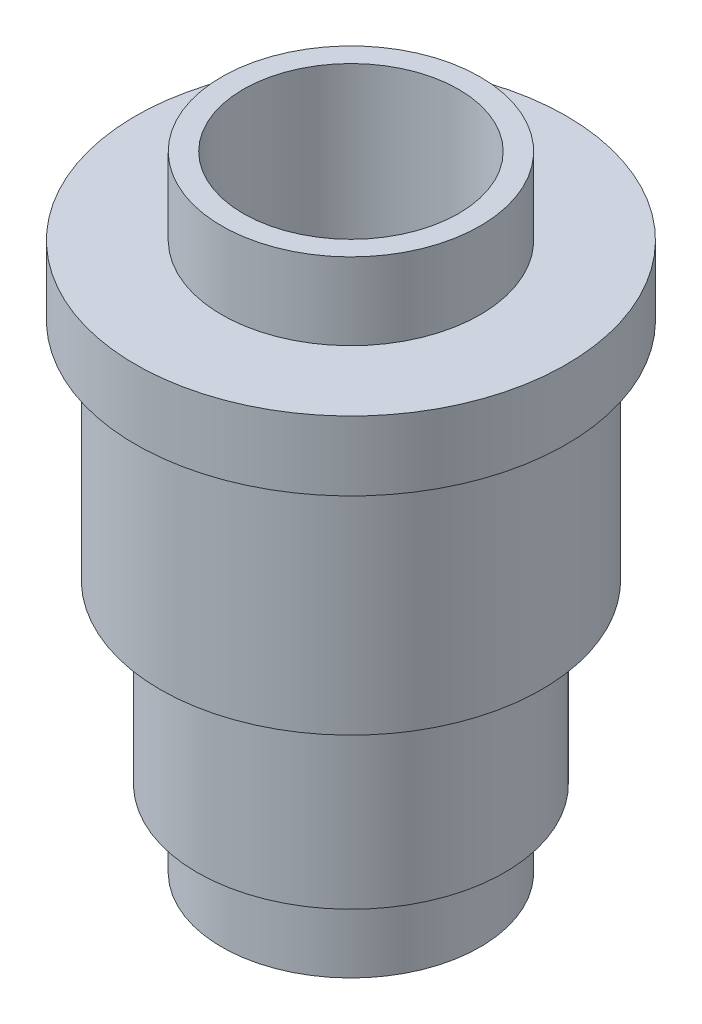
ISO-10303-21;
HEADER;
FILE_DESCRIPTION(('STEP AP214'),'2;1');
FILE_NAME('part.step','',(''),(''),'','','');
FILE_SCHEMA(('AUTOMOTIVE_DESIGN { 1 0 10303 214 1 1 1 1 }'));
ENDSEC;
DATA;
#1=APPLICATION_CONTEXT('core data for automotive mechanical design processes');
#2=APPLICATION_PROTOCOL_DEFINITION('international standard','automotive_design',2000,#1);
#3=PRODUCT_CONTEXT('',#1,'mechanical');
#4=PRODUCT('Part','Part','',(#3));
#5=PRODUCT_RELATED_PRODUCT_CATEGORY('part','',(#4));
#6=PRODUCT_DEFINITION_FORMATION('','',#4);
#7=PRODUCT_DEFINITION_CONTEXT('part definition',#1,'design');
#8=PRODUCT_DEFINITION('design','',#6,#7);
#9=PRODUCT_DEFINITION_SHAPE('','',#8);
#10=(LENGTH_UNIT() NAMED_UNIT(*) SI_UNIT(.MILLI.,.METRE.));
#11=(NAMED_UNIT(*) PLANE_ANGLE_UNIT() SI_UNIT($,.RADIAN.));
#12=(NAMED_UNIT(*) SI_UNIT($,.STERADIAN.) SOLID_ANGLE_UNIT());
#13=UNCERTAINTY_MEASURE_WITH_UNIT(LENGTH_MEASURE(1.E-05),#10,'distance_accuracy_value','');
#14=(GEOMETRIC_REPRESENTATION_CONTEXT(3) GLOBAL_UNCERTAINTY_ASSIGNED_CONTEXT((#13)) GLOBAL_UNIT_ASSIGNED_CONTEXT((#10,
#11,#12)) REPRESENTATION_CONTEXT('',''));
#15=CARTESIAN_POINT('',(0.,0.,0.));
#16=DIRECTION('',(0.,0.,1.));
#17=DIRECTION('',(1.,0.,0.));
#18=AXIS2_PLACEMENT_3D('',#15,#16,#17);
#19=CARTESIAN_POINT('',(0.,-2.5,0.));
#20=DIRECTION('',(0.,-1.,0.));
#21=DIRECTION('',(0.,0.,-1.));
#22=AXIS2_PLACEMENT_3D('',#19,#20,#21);
#23=PLANE('',#22);
#24=CARTESIAN_POINT('',(0.,-2.5,0.));
#25=DIRECTION('',(0.,-1.,0.));
#26=DIRECTION('',(0.,0.,-1.));
#27=AXIS2_PLACEMENT_3D('',#24,#25,#26);
#28=CIRCLE('',#27,4.2);
#29=CARTESIAN_POINT('',(0.,-2.5,-4.2));
#30=VERTEX_POINT('',#29);
#31=EDGE_CURVE('E22',#30,#30,#28,.T.);
#32=ORIENTED_EDGE('',*,*,#31,.T.);
#33=EDGE_LOOP('',(#32));
#34=FACE_BOUND('',#33,.T.);
#35=CARTESIAN_POINT('',(0.,-2.5,0.));
#36=DIRECTION('',(0.,1.,0.));
#37=DIRECTION('',(0.,0.,1.));
#38=AXIS2_PLACEMENT_3D('',#35,#36,#37);
#39=CIRCLE('',#38,3.5);
#40=CARTESIAN_POINT('',(0.,-2.5,3.5));
#41=VERTEX_POINT('',#40);
#42=EDGE_CURVE('E56',#41,#41,#39,.T.);
#43=ORIENTED_EDGE('',*,*,#42,.T.);
#44=EDGE_LOOP('',(#43));
#45=FACE_BOUND('',#44,.T.);
#46=ADVANCED_FACE('F15',(#34,#45),#23,.T.);
#47=CARTESIAN_POINT('',(0.,0.,0.));
#48=DIRECTION('',(0.,-1.,0.));
#49=DIRECTION('',(0.,0.,-1.));
#50=AXIS2_PLACEMENT_3D('',#47,#48,#49);
#51=CYLINDRICAL_SURFACE('',#50,4.2);
#52=CARTESIAN_POINT('',(0.,0.,0.));
#53=DIRECTION('',(0.,-1.,0.));
#54=DIRECTION('',(0.,0.,-1.));
#55=AXIS2_PLACEMENT_3D('',#52,#53,#54);
#56=CIRCLE('',#55,4.2);
#57=CARTESIAN_POINT('',(0.,0.,-4.2));
#58=VERTEX_POINT('',#57);
#59=EDGE_CURVE('E26',#58,#58,#56,.T.);
#60=ORIENTED_EDGE('',*,*,#59,.T.);
#61=EDGE_LOOP('',(#60));
#62=FACE_BOUND('',#61,.T.);
#63=ORIENTED_EDGE('',*,*,#31,.F.);
#64=EDGE_LOOP('',(#63));
#65=FACE_BOUND('',#64,.T.);
#66=ADVANCED_FACE('F74',(#62,#65),#51,.T.);
#67=CARTESIAN_POINT('',(4.2,0.,0.));
#68=DIRECTION('',(0.,-1.,0.));
#69=DIRECTION('',(0.,0.,-1.));
#70=AXIS2_PLACEMENT_3D('',#67,#68,#69);
#71=PLANE('',#70);
#72=CARTESIAN_POINT('',(0.,0.,0.));
#73=DIRECTION('',(0.,-1.,0.));
#74=DIRECTION('',(0.,0.,-1.));
#75=AXIS2_PLACEMENT_3D('',#72,#73,#74);
#76=CIRCLE('',#75,5.);
#77=CARTESIAN_POINT('',(0.,0.,-5.));
#78=VERTEX_POINT('',#77);
#79=EDGE_CURVE('E30',#78,#78,#76,.T.);
#80=ORIENTED_EDGE('',*,*,#79,.T.);
#81=EDGE_LOOP('',(#80));
#82=FACE_BOUND('',#81,.T.);
#83=ORIENTED_EDGE('',*,*,#59,.F.);
#84=EDGE_LOOP('',(#83));
#85=FACE_BOUND('',#84,.T.);
#86=ADVANCED_FACE('F79',(#82,#85),#71,.T.);
#87=CARTESIAN_POINT('',(0.,0.,0.));
#88=DIRECTION('',(0.,-1.,0.));
#89=DIRECTION('',(0.,0.,-1.));
#90=AXIS2_PLACEMENT_3D('',#87,#88,#89);
#91=CYLINDRICAL_SURFACE('',#90,5.);
#92=CARTESIAN_POINT('',(0.,5.75,0.));
#93=DIRECTION('',(0.,-1.,0.));
#94=DIRECTION('',(0.,0.,-1.));
#95=AXIS2_PLACEMENT_3D('',#92,#93,#94);
#96=CIRCLE('',#95,5.);
#97=CARTESIAN_POINT('',(0.,5.75,-5.));
#98=VERTEX_POINT('',#97);
#99=EDGE_CURVE('E35',#98,#98,#96,.T.);
#100=ORIENTED_EDGE('',*,*,#99,.T.);
#101=EDGE_LOOP('',(#100));
#102=FACE_BOUND('',#101,.T.);
#103=ORIENTED_EDGE('',*,*,#79,.F.);
#104=EDGE_LOOP('',(#103));
#105=FACE_BOUND('',#104,.T.);
#106=ADVANCED_FACE('F85',(#102,#105),#91,.T.);
#107=CARTESIAN_POINT('',(5.,5.75,0.));
#108=DIRECTION('',(0.,-1.,0.));
#109=DIRECTION('',(0.,0.,-1.));
#110=AXIS2_PLACEMENT_3D('',#107,#108,#109);
#111=PLANE('',#110);
#112=CARTESIAN_POINT('',(0.,5.75,0.));
#113=DIRECTION('',(0.,-1.,0.));
#114=DIRECTION('',(0.,0.,-1.));
#115=AXIS2_PLACEMENT_3D('',#112,#113,#114);
#116=CIRCLE('',#115,6.2);
#117=CARTESIAN_POINT('',(0.,5.75,-6.2));
#118=VERTEX_POINT('',#117);
#119=EDGE_CURVE('E10',#118,#118,#116,.T.);
#120=ORIENTED_EDGE('',*,*,#119,.T.);
#121=EDGE_LOOP('',(#120));
#122=FACE_BOUND('',#121,.T.);
#123=ORIENTED_EDGE('',*,*,#99,.F.);
#124=EDGE_LOOP('',(#123));
#125=FACE_BOUND('',#124,.T.);
#126=ADVANCED_FACE('F83',(#122,#125),#111,.T.);
#127=CARTESIAN_POINT('',(0.,0.,0.));
#128=DIRECTION('',(0.,-1.,0.));
#129=DIRECTION('',(0.,0.,-1.));
#130=AXIS2_PLACEMENT_3D('',#127,#128,#129);
#131=CYLINDRICAL_SURFACE('',#130,6.2);
#132=CARTESIAN_POINT('',(0.,13.05,0.));
#133=DIRECTION('',(0.,-1.,0.));
#134=DIRECTION('',(0.,0.,-1.));
#135=AXIS2_PLACEMENT_3D('',#132,#133,#134);
#136=CIRCLE('',#135,6.2);
#137=CARTESIAN_POINT('',(0.,13.05,-6.2));
#138=VERTEX_POINT('',#137);
#139=EDGE_CURVE('E38',#138,#138,#136,.T.);
#140=ORIENTED_EDGE('',*,*,#139,.T.);
#141=EDGE_LOOP('',(#140));
#142=FACE_BOUND('',#141,.T.);
#143=ORIENTED_EDGE('',*,*,#119,.F.);
#144=EDGE_LOOP('',(#143));
#145=FACE_BOUND('',#144,.T.);
#146=ADVANCED_FACE('F17',(#142,#145),#131,.T.);
#147=CARTESIAN_POINT('',(6.2,13.05,0.));
#148=DIRECTION('',(0.,-1.,0.));
#149=DIRECTION('',(0.,0.,-1.));
#150=AXIS2_PLACEMENT_3D('',#147,#148,#149);
#151=PLANE('',#150);
#152=CARTESIAN_POINT('',(0.,13.05,0.));
#153=DIRECTION('',(0.,-1.,0.));
#154=DIRECTION('',(0.,0.,-1.));
#155=AXIS2_PLACEMENT_3D('',#152,#153,#154);
#156=CIRCLE('',#155,7.);
#157=CARTESIAN_POINT('',(0.,13.05,-7.));
#158=VERTEX_POINT('',#157);
#159=EDGE_CURVE('E41',#158,#158,#156,.T.);
#160=ORIENTED_EDGE('',*,*,#159,.T.);
#161=EDGE_LOOP('',(#160));
#162=FACE_BOUND('',#161,.T.);
#163=ORIENTED_EDGE('',*,*,#139,.F.);
#164=EDGE_LOOP('',(#163));
#165=FACE_BOUND('',#164,.T.);
#166=ADVANCED_FACE('F90',(#162,#165),#151,.T.);
#167=CARTESIAN_POINT('',(0.,0.,0.));
#168=DIRECTION('',(0.,-1.,0.));
#169=DIRECTION('',(0.,0.,-1.));
#170=AXIS2_PLACEMENT_3D('',#167,#168,#169);
#171=CYLINDRICAL_SURFACE('',#170,7.);
#172=CARTESIAN_POINT('',(0.,15.3,0.));
#173=DIRECTION('',(0.,-1.,0.));
#174=DIRECTION('',(0.,0.,-1.));
#175=AXIS2_PLACEMENT_3D('',#172,#173,#174);
#176=CIRCLE('',#175,7.);
#177=CARTESIAN_POINT('',(0.,15.3,-7.));
#178=VERTEX_POINT('',#177);
#179=EDGE_CURVE('E44',#178,#178,#176,.T.);
#180=ORIENTED_EDGE('',*,*,#179,.T.);
#181=EDGE_LOOP('',(#180));
#182=FACE_BOUND('',#181,.T.);
#183=ORIENTED_EDGE('',*,*,#159,.F.);
#184=EDGE_LOOP('',(#183));
#185=FACE_BOUND('',#184,.T.);
#186=ADVANCED_FACE('F108',(#182,#185),#171,.T.);
#187=CARTESIAN_POINT('',(7.,15.3,0.));
#188=DIRECTION('',(0.,1.,0.));
#189=DIRECTION('',(0.,0.,1.));
#190=AXIS2_PLACEMENT_3D('',#187,#188,#189);
#191=PLANE('',#190);
#192=CARTESIAN_POINT('',(0.,15.3,0.));
#193=DIRECTION('',(0.,-1.,0.));
#194=DIRECTION('',(0.,0.,-1.));
#195=AXIS2_PLACEMENT_3D('',#192,#193,#194);
#196=CIRCLE('',#195,4.2);
#197=CARTESIAN_POINT('',(0.,15.3,-4.2));
#198=VERTEX_POINT('',#197);
#199=EDGE_CURVE('E47',#198,#198,#196,.T.);
#200=ORIENTED_EDGE('',*,*,#199,.T.);
#201=EDGE_LOOP('',(#200));
#202=FACE_BOUND('',#201,.T.);
#203=ORIENTED_EDGE('',*,*,#179,.F.);
#204=EDGE_LOOP('',(#203));
#205=FACE_BOUND('',#204,.T.);
#206=ADVANCED_FACE('F112',(#202,#205),#191,.T.);
#207=CARTESIAN_POINT('',(0.,0.,0.));
#208=DIRECTION('',(0.,-1.,0.));
#209=DIRECTION('',(0.,0.,-1.));
#210=AXIS2_PLACEMENT_3D('',#207,#208,#209);
#211=CYLINDRICAL_SURFACE('',#210,4.2);
#212=CARTESIAN_POINT('',(0.,17.8,0.));
#213=DIRECTION('',(0.,-1.,0.));
#214=DIRECTION('',(0.,0.,-1.));
#215=AXIS2_PLACEMENT_3D('',#212,#213,#214);
#216=CIRCLE('',#215,4.2);
#217=CARTESIAN_POINT('',(0.,17.8,-4.2));
#218=VERTEX_POINT('',#217);
#219=EDGE_CURVE('E50',#218,#218,#216,.T.);
#220=ORIENTED_EDGE('',*,*,#219,.T.);
#221=EDGE_LOOP('',(#220));
#222=FACE_BOUND('',#221,.T.);
#223=ORIENTED_EDGE('',*,*,#199,.F.);
#224=EDGE_LOOP('',(#223));
#225=FACE_BOUND('',#224,.T.);
#226=ADVANCED_FACE('F70',(#222,#225),#211,.T.);
#227=CARTESIAN_POINT('',(4.2,17.8,0.));
#228=DIRECTION('',(0.,1.,0.));
#229=DIRECTION('',(0.,0.,1.));
#230=AXIS2_PLACEMENT_3D('',#227,#228,#229);
#231=PLANE('',#230);
#232=CARTESIAN_POINT('',(0.,17.8,0.));
#233=DIRECTION('',(0.,1.,0.));
#234=DIRECTION('',(0.,0.,1.));
#235=AXIS2_PLACEMENT_3D('',#232,#233,#234);
#236=CIRCLE('',#235,3.5);
#237=CARTESIAN_POINT('',(0.,17.8,3.5));
#238=VERTEX_POINT('',#237);
#239=EDGE_CURVE('E53',#238,#238,#236,.T.);
#240=ORIENTED_EDGE('',*,*,#239,.F.);
#241=EDGE_LOOP('',(#240));
#242=FACE_BOUND('',#241,.T.);
#243=ORIENTED_EDGE('',*,*,#219,.F.);
#244=EDGE_LOOP('',(#243));
#245=FACE_BOUND('',#244,.T.);
#246=ADVANCED_FACE('F63',(#242,#245),#231,.T.);
#247=CARTESIAN_POINT('',(0.,0.,0.));
#248=DIRECTION('',(0.,1.,0.));
#249=DIRECTION('',(0.,0.,1.));
#250=AXIS2_PLACEMENT_3D('',#247,#248,#249);
#251=CYLINDRICAL_SURFACE('',#250,3.5);
#252=ORIENTED_EDGE('',*,*,#239,.T.);
#253=EDGE_LOOP('',(#252));
#254=FACE_BOUND('',#253,.T.);
#255=ORIENTED_EDGE('',*,*,#42,.F.);
#256=EDGE_LOOP('',(#255));
#257=FACE_BOUND('',#256,.T.);
#258=ADVANCED_FACE('F61',(#254,#257),#251,.F.);
#259=CLOSED_SHELL('',(#46,#66,#86,#106,#126,#146,#166,#186,#206,#226,#246,#258));
#260=MANIFOLD_SOLID_BREP('B1',#259);
#261=ADVANCED_BREP_SHAPE_REPRESENTATION('',(#18,#260),#14);
#262=SHAPE_DEFINITION_REPRESENTATION(#9,#261);
ENDSEC;
END-ISO-10303-21;
